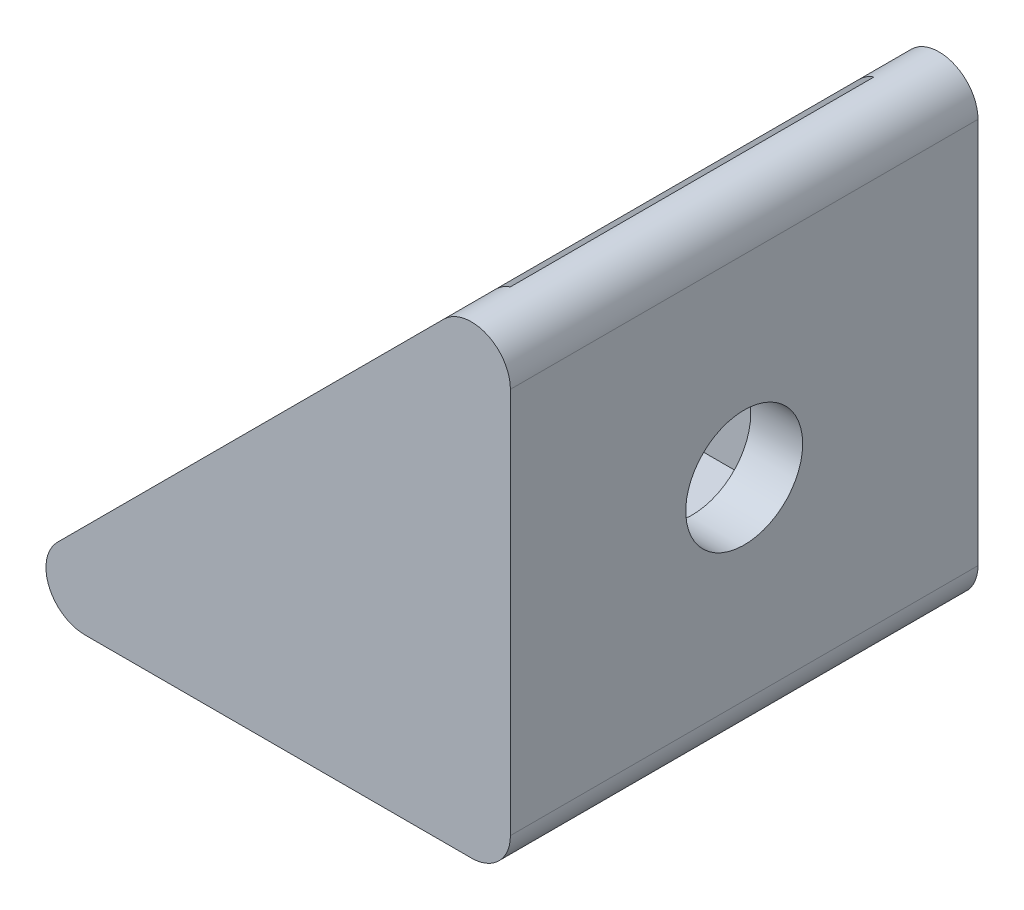
ISO-10303-21;
HEADER;
FILE_DESCRIPTION(('STEP AP214'),'2;1');
FILE_NAME('part.step','',(''),(''),'','','');
FILE_SCHEMA(('AUTOMOTIVE_DESIGN { 1 0 10303 214 1 1 1 1 }'));
ENDSEC;
DATA;
#1=APPLICATION_CONTEXT('core data for automotive mechanical design processes');
#2=APPLICATION_PROTOCOL_DEFINITION('international standard','automotive_design',2000,#1);
#3=PRODUCT_CONTEXT('',#1,'mechanical');
#4=PRODUCT('Part','Part','',(#3));
#5=PRODUCT_RELATED_PRODUCT_CATEGORY('part','',(#4));
#6=PRODUCT_DEFINITION_FORMATION('','',#4);
#7=PRODUCT_DEFINITION_CONTEXT('part definition',#1,'design');
#8=PRODUCT_DEFINITION('design','',#6,#7);
#9=PRODUCT_DEFINITION_SHAPE('','',#8);
#10=(LENGTH_UNIT() NAMED_UNIT(*) SI_UNIT(.MILLI.,.METRE.));
#11=(NAMED_UNIT(*) PLANE_ANGLE_UNIT() SI_UNIT($,.RADIAN.));
#12=(NAMED_UNIT(*) SI_UNIT($,.STERADIAN.) SOLID_ANGLE_UNIT());
#13=UNCERTAINTY_MEASURE_WITH_UNIT(LENGTH_MEASURE(1.E-05),#10,'distance_accuracy_value','');
#14=(GEOMETRIC_REPRESENTATION_CONTEXT(3) GLOBAL_UNCERTAINTY_ASSIGNED_CONTEXT((#13)) GLOBAL_UNIT_ASSIGNED_CONTEXT((#10,
#11,#12)) REPRESENTATION_CONTEXT('',''));
#15=CARTESIAN_POINT('',(0.,0.,0.));
#16=DIRECTION('',(0.,0.,1.));
#17=DIRECTION('',(1.,0.,0.));
#18=AXIS2_PLACEMENT_3D('',#15,#16,#17);
#19=CARTESIAN_POINT('',(-2.56066017177985,17.4393398282202,18.));
#20=DIRECTION('',(0.707106781186547,-0.707106781186547,0.));
#21=DIRECTION('',(0.707106781186548,0.707106781186548,0.));
#22=AXIS2_PLACEMENT_3D('',#19,#20,#21);
#23=PLANE('',#22);
#24=DIRECTION('',(0.,0.,-1.));
#25=VECTOR('',#24,1.);
#26=CARTESIAN_POINT('',(-2.56066017177985,17.4393398282202,18.));
#27=LINE('',#26,#25);
#28=CARTESIAN_POINT('',(-2.56066017177985,17.4393398282202,18.));
#29=VERTEX_POINT('',#28);
#30=CARTESIAN_POINT('',(-2.56066017177985,17.4393398282202,16.));
#31=VERTEX_POINT('',#30);
#32=EDGE_CURVE('E159',#29,#31,#27,.T.);
#33=ORIENTED_EDGE('',*,*,#32,.T.);
#34=DIRECTION('',(-0.707106781186548,-0.707106781186548,0.));
#35=VECTOR('',#34,1.);
#36=CARTESIAN_POINT('',(-2.56066017177985,17.4393398282202,16.));
#37=LINE('',#36,#35);
#38=CARTESIAN_POINT('',(-17.4393398282202,2.56066017177985,16.));
#39=VERTEX_POINT('',#38);
#40=EDGE_CURVE('E183',#31,#39,#37,.T.);
#41=ORIENTED_EDGE('',*,*,#40,.T.);
#42=DIRECTION('',(0.,0.,-1.));
#43=VECTOR('',#42,1.);
#44=CARTESIAN_POINT('',(-17.4393398282202,2.56066017177985,18.));
#45=LINE('',#44,#43);
#46=CARTESIAN_POINT('',(-17.4393398282202,2.56066017177985,18.));
#47=VERTEX_POINT('',#46);
#48=EDGE_CURVE('E155',#47,#39,#45,.T.);
#49=ORIENTED_EDGE('',*,*,#48,.F.);
#50=DIRECTION('',(-0.707106781186547,-0.707106781186547,0.));
#51=VECTOR('',#50,1.);
#52=CARTESIAN_POINT('',(-2.56066017177985,17.4393398282202,18.));
#53=LINE('',#52,#51);
#54=EDGE_CURVE('E100',#29,#47,#53,.T.);
#55=ORIENTED_EDGE('',*,*,#54,.F.);
#56=EDGE_LOOP('',(#33,#41,#49,#55));
#57=FACE_BOUND('',#56,.T.);
#58=ADVANCED_FACE('F39',(#57),#23,.F.);
#59=CARTESIAN_POINT('',(-1.5,16.3786796564404,18.));
#60=DIRECTION('',(0.,0.,-1.));
#61=DIRECTION('',(-1.,0.,0.));
#62=AXIS2_PLACEMENT_3D('',#59,#60,#61);
#63=CYLINDRICAL_SURFACE('',#62,1.5);
#64=DIRECTION('',(0.,0.,-1.));
#65=VECTOR('',#64,1.);
#66=CARTESIAN_POINT('',(-2.,17.7928932188135,18.));
#67=LINE('',#66,#65);
#68=CARTESIAN_POINT('',(-2.,17.7928932188135,2.));
#69=VERTEX_POINT('',#68);
#70=CARTESIAN_POINT('',(-2.,17.7928932188135,16.));
#71=VERTEX_POINT('',#70);
#72=EDGE_CURVE('E11',#69,#71,#67,.F.);
#73=ORIENTED_EDGE('',*,*,#72,.T.);
#74=CARTESIAN_POINT('',(-1.5,16.3786796564404,16.));
#75=DIRECTION('',(0.,0.,1.));
#76=DIRECTION('',(1.,0.,0.));
#77=AXIS2_PLACEMENT_3D('',#74,#75,#76);
#78=CIRCLE('',#77,1.5);
#79=EDGE_CURVE('E141',#71,#31,#78,.T.);
#80=ORIENTED_EDGE('',*,*,#79,.T.);
#81=ORIENTED_EDGE('',*,*,#32,.F.);
#82=CARTESIAN_POINT('',(-1.5,16.3786796564404,18.));
#83=DIRECTION('',(0.,0.,1.));
#84=DIRECTION('',(1.,0.,0.));
#85=AXIS2_PLACEMENT_3D('',#82,#83,#84);
#86=CIRCLE('',#85,1.5);
#87=CARTESIAN_POINT('',(0.,16.3786796564403,18.));
#88=VERTEX_POINT('',#87);
#89=EDGE_CURVE('E150',#88,#29,#86,.T.);
#90=ORIENTED_EDGE('',*,*,#89,.F.);
#91=DIRECTION('',(0.,0.,-1.));
#92=VECTOR('',#91,1.);
#93=CARTESIAN_POINT('',(0.,16.3786796564403,18.));
#94=LINE('',#93,#92);
#95=CARTESIAN_POINT('',(0.,16.3786796564403,0.));
#96=VERTEX_POINT('',#95);
#97=EDGE_CURVE('E133',#88,#96,#94,.T.);
#98=ORIENTED_EDGE('',*,*,#97,.T.);
#99=CARTESIAN_POINT('',(-1.5,16.3786796564404,0.));
#100=DIRECTION('',(0.,0.,1.));
#101=DIRECTION('',(1.,0.,0.));
#102=AXIS2_PLACEMENT_3D('',#99,#100,#101);
#103=CIRCLE('',#102,1.5);
#104=CARTESIAN_POINT('',(-2.56066017177985,17.4393398282202,0.));
#105=VERTEX_POINT('',#104);
#106=EDGE_CURVE('E137',#96,#105,#103,.T.);
#107=ORIENTED_EDGE('',*,*,#106,.T.);
#108=CARTESIAN_POINT('',(-2.56066017177985,17.4393398282202,2.));
#109=VERTEX_POINT('',#108);
#110=EDGE_CURVE('E158',#109,#105,#27,.T.);
#111=ORIENTED_EDGE('',*,*,#110,.F.);
#112=CARTESIAN_POINT('',(-1.5,16.3786796564404,2.));
#113=DIRECTION('',(0.,0.,-1.));
#114=DIRECTION('',(-1.,0.,0.));
#115=AXIS2_PLACEMENT_3D('',#112,#113,#114);
#116=CIRCLE('',#115,1.5);
#117=EDGE_CURVE('E189',#109,#69,#116,.T.);
#118=ORIENTED_EDGE('',*,*,#117,.T.);
#119=EDGE_LOOP('',(#73,#80,#81,#90,#98,#107,#111,#118));
#120=FACE_BOUND('',#119,.T.);
#121=ADVANCED_FACE('F41',(#120),#63,.T.);
#122=CARTESIAN_POINT('',(-17.4393398282202,2.56066017177985,2.));
#123=VERTEX_POINT('',#122);
#124=CARTESIAN_POINT('',(-17.4393398282202,2.56066017177985,0.));
#125=VERTEX_POINT('',#124);
#126=EDGE_CURVE('E154',#123,#125,#45,.T.);
#127=ORIENTED_EDGE('',*,*,#126,.F.);
#128=DIRECTION('',(0.707106781186548,0.707106781186548,0.));
#129=VECTOR('',#128,1.);
#130=CARTESIAN_POINT('',(-2.56066017177985,17.4393398282202,2.));
#131=LINE('',#130,#129);
#132=EDGE_CURVE('E193',#123,#109,#131,.T.);
#133=ORIENTED_EDGE('',*,*,#132,.T.);
#134=ORIENTED_EDGE('',*,*,#110,.T.);
#135=DIRECTION('',(-0.707106781186547,-0.707106781186547,0.));
#136=VECTOR('',#135,1.);
#137=CARTESIAN_POINT('',(-2.56066017177985,17.4393398282202,0.));
#138=LINE('',#137,#136);
#139=EDGE_CURVE('E140',#105,#125,#138,.T.);
#140=ORIENTED_EDGE('',*,*,#139,.T.);
#141=EDGE_LOOP('',(#127,#133,#134,#140));
#142=FACE_BOUND('',#141,.T.);
#143=ADVANCED_FACE('F252',(#142),#23,.F.);
#144=CARTESIAN_POINT('',(-16.3786796564404,1.5,18.));
#145=DIRECTION('',(0.,0.,-1.));
#146=DIRECTION('',(-1.,0.,0.));
#147=AXIS2_PLACEMENT_3D('',#144,#145,#146);
#148=CYLINDRICAL_SURFACE('',#147,1.5);
#149=ORIENTED_EDGE('',*,*,#48,.T.);
#150=CARTESIAN_POINT('',(-16.3786796564404,1.5,16.));
#151=DIRECTION('',(0.,0.,1.));
#152=DIRECTION('',(1.,0.,0.));
#153=AXIS2_PLACEMENT_3D('',#150,#151,#152);
#154=CIRCLE('',#153,1.5);
#155=CARTESIAN_POINT('',(-17.7928932188135,2.,16.));
#156=VERTEX_POINT('',#155);
#157=EDGE_CURVE('E48',#39,#156,#154,.T.);
#158=ORIENTED_EDGE('',*,*,#157,.T.);
#159=DIRECTION('',(0.,0.,-1.));
#160=VECTOR('',#159,1.);
#161=CARTESIAN_POINT('',(-17.7928932188135,2.,18.));
#162=LINE('',#161,#160);
#163=CARTESIAN_POINT('',(-17.7928932188135,2.,2.));
#164=VERTEX_POINT('',#163);
#165=EDGE_CURVE('E161',#164,#156,#162,.F.);
#166=ORIENTED_EDGE('',*,*,#165,.F.);
#167=CARTESIAN_POINT('',(-16.3786796564404,1.5,2.));
#168=DIRECTION('',(0.,0.,-1.));
#169=DIRECTION('',(-1.,0.,0.));
#170=AXIS2_PLACEMENT_3D('',#167,#168,#169);
#171=CIRCLE('',#170,1.5);
#172=EDGE_CURVE('E163',#164,#123,#171,.T.);
#173=ORIENTED_EDGE('',*,*,#172,.T.);
#174=ORIENTED_EDGE('',*,*,#126,.T.);
#175=CARTESIAN_POINT('',(-16.3786796564404,1.5,0.));
#176=DIRECTION('',(0.,0.,1.));
#177=DIRECTION('',(1.,0.,0.));
#178=AXIS2_PLACEMENT_3D('',#175,#176,#177);
#179=CIRCLE('',#178,1.5);
#180=CARTESIAN_POINT('',(-16.3786796564403,0.,0.));
#181=VERTEX_POINT('',#180);
#182=EDGE_CURVE('E144',#125,#181,#179,.T.);
#183=ORIENTED_EDGE('',*,*,#182,.T.);
#184=DIRECTION('',(0.,0.,-1.));
#185=VECTOR('',#184,1.);
#186=CARTESIAN_POINT('',(-16.3786796564403,0.,18.));
#187=LINE('',#186,#185);
#188=CARTESIAN_POINT('',(-16.3786796564403,0.,18.));
#189=VERTEX_POINT('',#188);
#190=EDGE_CURVE('E128',#189,#181,#187,.T.);
#191=ORIENTED_EDGE('',*,*,#190,.F.);
#192=CARTESIAN_POINT('',(-16.3786796564404,1.5,18.));
#193=DIRECTION('',(0.,0.,1.));
#194=DIRECTION('',(1.,0.,0.));
#195=AXIS2_PLACEMENT_3D('',#192,#193,#194);
#196=CIRCLE('',#195,1.5);
#197=EDGE_CURVE('E116',#47,#189,#196,.T.);
#198=ORIENTED_EDGE('',*,*,#197,.F.);
#199=EDGE_LOOP('',(#149,#158,#166,#173,#174,#183,#191,#198));
#200=FACE_BOUND('',#199,.T.);
#201=ADVANCED_FACE('F171',(#200),#148,.T.);
#202=CARTESIAN_POINT('',(-16.3786796564403,0.,18.));
#203=DIRECTION('',(0.,1.,0.));
#204=DIRECTION('',(0.,0.,1.));
#205=AXIS2_PLACEMENT_3D('',#202,#203,#204);
#206=PLANE('',#205);
#207=CARTESIAN_POINT('',(-8.93933982822017,0.,9.));
#208=DIRECTION('',(0.,-1.,0.));
#209=DIRECTION('',(0.,0.,-1.));
#210=AXIS2_PLACEMENT_3D('',#207,#208,#209);
#211=CIRCLE('',#210,2.24999999999999);
#212=CARTESIAN_POINT('',(-8.93933982822017,0.,6.75000000000001));
#213=VERTEX_POINT('',#212);
#214=EDGE_CURVE('E225',#213,#213,#211,.T.);
#215=ORIENTED_EDGE('',*,*,#214,.F.);
#216=EDGE_LOOP('',(#215));
#217=FACE_BOUND('',#216,.T.);
#218=DIRECTION('',(1.,0.,0.));
#219=VECTOR('',#218,1.);
#220=CARTESIAN_POINT('',(-16.3786796564403,0.,0.));
#221=LINE('',#220,#219);
#222=CARTESIAN_POINT('',(-1.50000000000001,0.,0.));
#223=VERTEX_POINT('',#222);
#224=EDGE_CURVE('E125',#181,#223,#221,.T.);
#225=ORIENTED_EDGE('',*,*,#224,.T.);
#226=DIRECTION('',(0.,0.,-1.));
#227=VECTOR('',#226,1.);
#228=CARTESIAN_POINT('',(-1.50000000000001,0.,18.));
#229=LINE('',#228,#227);
#230=CARTESIAN_POINT('',(-1.50000000000001,0.,18.));
#231=VERTEX_POINT('',#230);
#232=EDGE_CURVE('E122',#231,#223,#229,.T.);
#233=ORIENTED_EDGE('',*,*,#232,.F.);
#234=DIRECTION('',(1.,0.,0.));
#235=VECTOR('',#234,1.);
#236=CARTESIAN_POINT('',(-16.3786796564403,0.,18.));
#237=LINE('',#236,#235);
#238=EDGE_CURVE('E109',#189,#231,#237,.T.);
#239=ORIENTED_EDGE('',*,*,#238,.F.);
#240=ORIENTED_EDGE('',*,*,#190,.T.);
#241=EDGE_LOOP('',(#225,#233,#239,#240));
#242=FACE_BOUND('',#241,.T.);
#243=ADVANCED_FACE('F123',(#217,#242),#206,.F.);
#244=CARTESIAN_POINT('',(-1.5,1.5,18.));
#245=DIRECTION('',(0.,0.,-1.));
#246=DIRECTION('',(-1.,0.,0.));
#247=AXIS2_PLACEMENT_3D('',#244,#245,#246);
#248=CYLINDRICAL_SURFACE('',#247,1.5);
#249=CARTESIAN_POINT('',(-1.5,1.5,0.));
#250=DIRECTION('',(0.,0.,1.));
#251=DIRECTION('',(-1.,0.,0.));
#252=AXIS2_PLACEMENT_3D('',#249,#250,#251);
#253=CIRCLE('',#252,1.5);
#254=CARTESIAN_POINT('',(0.,1.50000000000001,0.));
#255=VERTEX_POINT('',#254);
#256=EDGE_CURVE('E147',#223,#255,#253,.T.);
#257=ORIENTED_EDGE('',*,*,#256,.T.);
#258=DIRECTION('',(0.,0.,-1.));
#259=VECTOR('',#258,1.);
#260=CARTESIAN_POINT('',(0.,1.50000000000001,18.));
#261=LINE('',#260,#259);
#262=CARTESIAN_POINT('',(0.,1.50000000000001,18.));
#263=VERTEX_POINT('',#262);
#264=EDGE_CURVE('E129',#263,#255,#261,.T.);
#265=ORIENTED_EDGE('',*,*,#264,.F.);
#266=CARTESIAN_POINT('',(-1.5,1.5,18.));
#267=DIRECTION('',(0.,0.,1.));
#268=DIRECTION('',(-1.,0.,0.));
#269=AXIS2_PLACEMENT_3D('',#266,#267,#268);
#270=CIRCLE('',#269,1.5);
#271=EDGE_CURVE('E113',#231,#263,#270,.T.);
#272=ORIENTED_EDGE('',*,*,#271,.F.);
#273=ORIENTED_EDGE('',*,*,#232,.T.);
#274=EDGE_LOOP('',(#257,#265,#272,#273));
#275=FACE_BOUND('',#274,.T.);
#276=ADVANCED_FACE('F131',(#275),#248,.T.);
#277=CARTESIAN_POINT('',(0.,1.50000000000001,18.));
#278=DIRECTION('',(-1.,0.,0.));
#279=DIRECTION('',(0.,0.,1.));
#280=AXIS2_PLACEMENT_3D('',#277,#278,#279);
#281=PLANE('',#280);
#282=CARTESIAN_POINT('',(0.,8.93933982822016,9.));
#283=DIRECTION('',(1.,0.,0.));
#284=DIRECTION('',(0.,0.,-1.));
#285=AXIS2_PLACEMENT_3D('',#282,#283,#284);
#286=CIRCLE('',#285,2.25);
#287=CARTESIAN_POINT('',(0.,8.93933982822016,6.75));
#288=VERTEX_POINT('',#287);
#289=EDGE_CURVE('E222',#288,#288,#286,.T.);
#290=ORIENTED_EDGE('',*,*,#289,.F.);
#291=EDGE_LOOP('',(#290));
#292=FACE_BOUND('',#291,.T.);
#293=DIRECTION('',(0.,1.,0.));
#294=VECTOR('',#293,1.);
#295=CARTESIAN_POINT('',(0.,1.50000000000001,0.));
#296=LINE('',#295,#294);
#297=EDGE_CURVE('E91',#255,#96,#296,.T.);
#298=ORIENTED_EDGE('',*,*,#297,.T.);
#299=ORIENTED_EDGE('',*,*,#97,.F.);
#300=DIRECTION('',(0.,1.,0.));
#301=VECTOR('',#300,1.);
#302=CARTESIAN_POINT('',(0.,1.50000000000001,18.));
#303=LINE('',#302,#301);
#304=EDGE_CURVE('E64',#263,#88,#303,.T.);
#305=ORIENTED_EDGE('',*,*,#304,.F.);
#306=ORIENTED_EDGE('',*,*,#264,.T.);
#307=EDGE_LOOP('',(#298,#299,#305,#306));
#308=FACE_BOUND('',#307,.T.);
#309=ADVANCED_FACE('F258',(#292,#308),#281,.F.);
#310=CARTESIAN_POINT('',(-1.5,16.3786796564404,18.));
#311=DIRECTION('',(0.,0.,1.));
#312=DIRECTION('',(1.,0.,0.));
#313=AXIS2_PLACEMENT_3D('',#310,#311,#312);
#314=PLANE('',#313);
#315=ORIENTED_EDGE('',*,*,#89,.T.);
#316=ORIENTED_EDGE('',*,*,#54,.T.);
#317=ORIENTED_EDGE('',*,*,#197,.T.);
#318=ORIENTED_EDGE('',*,*,#238,.T.);
#319=ORIENTED_EDGE('',*,*,#271,.T.);
#320=ORIENTED_EDGE('',*,*,#304,.T.);
#321=EDGE_LOOP('',(#315,#316,#317,#318,#319,#320));
#322=FACE_BOUND('',#321,.T.);
#323=ADVANCED_FACE('F111',(#322),#314,.T.);
#324=CARTESIAN_POINT('',(-1.5,16.3786796564404,0.));
#325=DIRECTION('',(0.,0.,1.));
#326=DIRECTION('',(1.,0.,0.));
#327=AXIS2_PLACEMENT_3D('',#324,#325,#326);
#328=PLANE('',#327);
#329=ORIENTED_EDGE('',*,*,#106,.F.);
#330=ORIENTED_EDGE('',*,*,#297,.F.);
#331=ORIENTED_EDGE('',*,*,#256,.F.);
#332=ORIENTED_EDGE('',*,*,#224,.F.);
#333=ORIENTED_EDGE('',*,*,#182,.F.);
#334=ORIENTED_EDGE('',*,*,#139,.F.);
#335=EDGE_LOOP('',(#329,#330,#331,#332,#333,#334));
#336=FACE_BOUND('',#335,.T.);
#337=ADVANCED_FACE('F256',(#336),#328,.F.);
#338=CARTESIAN_POINT('',(-2.,17.8786796564404,2.));
#339=DIRECTION('',(1.,0.,0.));
#340=DIRECTION('',(0.,0.,-1.));
#341=AXIS2_PLACEMENT_3D('',#338,#339,#340);
#342=PLANE('',#341);
#343=CARTESIAN_POINT('',(-2.,8.93933982822016,9.));
#344=DIRECTION('',(1.,0.,0.));
#345=DIRECTION('',(0.,0.,-1.));
#346=AXIS2_PLACEMENT_3D('',#343,#344,#345);
#347=CIRCLE('',#346,2.25);
#348=CARTESIAN_POINT('',(-2.,8.93933982822016,6.75));
#349=VERTEX_POINT('',#348);
#350=EDGE_CURVE('E219',#349,#349,#347,.T.);
#351=ORIENTED_EDGE('',*,*,#350,.T.);
#352=EDGE_LOOP('',(#351));
#353=FACE_BOUND('',#352,.T.);
#354=DIRECTION('',(0.,-1.,0.));
#355=VECTOR('',#354,1.);
#356=CARTESIAN_POINT('',(-2.,17.8786796564404,2.));
#357=LINE('',#356,#355);
#358=CARTESIAN_POINT('',(-2.,2.,2.));
#359=VERTEX_POINT('',#358);
#360=EDGE_CURVE('E211',#69,#359,#357,.T.);
#361=ORIENTED_EDGE('',*,*,#360,.T.);
#362=DIRECTION('',(0.,0.,1.));
#363=VECTOR('',#362,1.);
#364=CARTESIAN_POINT('',(-2.,2.,2.));
#365=LINE('',#364,#363);
#366=CARTESIAN_POINT('',(-2.,2.,16.));
#367=VERTEX_POINT('',#366);
#368=EDGE_CURVE('E210',#359,#367,#365,.T.);
#369=ORIENTED_EDGE('',*,*,#368,.T.);
#370=DIRECTION('',(0.,-1.,0.));
#371=VECTOR('',#370,1.);
#372=CARTESIAN_POINT('',(-2.,17.8786796564404,16.));
#373=LINE('',#372,#371);
#374=EDGE_CURVE('E202',#71,#367,#373,.T.);
#375=ORIENTED_EDGE('',*,*,#374,.F.);
#376=ORIENTED_EDGE('',*,*,#72,.F.);
#377=EDGE_LOOP('',(#361,#369,#375,#376));
#378=FACE_BOUND('',#377,.T.);
#379=ADVANCED_FACE('F208',(#353,#378),#342,.F.);
#380=CARTESIAN_POINT('',(-19.221313325378,17.8786796564404,16.));
#381=DIRECTION('',(0.,0.,1.));
#382=DIRECTION('',(1.,0.,0.));
#383=AXIS2_PLACEMENT_3D('',#380,#381,#382);
#384=PLANE('',#383);
#385=ORIENTED_EDGE('',*,*,#374,.T.);
#386=DIRECTION('',(-1.,0.,0.));
#387=VECTOR('',#386,1.);
#388=CARTESIAN_POINT('',(-19.221313325378,2.,16.));
#389=LINE('',#388,#387);
#390=EDGE_CURVE('E186',#367,#156,#389,.T.);
#391=ORIENTED_EDGE('',*,*,#390,.T.);
#392=ORIENTED_EDGE('',*,*,#157,.F.);
#393=ORIENTED_EDGE('',*,*,#40,.F.);
#394=ORIENTED_EDGE('',*,*,#79,.F.);
#395=EDGE_LOOP('',(#385,#391,#392,#393,#394));
#396=FACE_BOUND('',#395,.T.);
#397=ADVANCED_FACE('F181',(#396),#384,.F.);
#398=CARTESIAN_POINT('',(-19.221313325378,17.8786796564404,2.));
#399=DIRECTION('',(0.,0.,-1.));
#400=DIRECTION('',(-1.,0.,0.));
#401=AXIS2_PLACEMENT_3D('',#398,#399,#400);
#402=PLANE('',#401);
#403=ORIENTED_EDGE('',*,*,#132,.F.);
#404=ORIENTED_EDGE('',*,*,#172,.F.);
#405=DIRECTION('',(1.,0.,0.));
#406=VECTOR('',#405,1.);
#407=CARTESIAN_POINT('',(-19.221313325378,2.,2.));
#408=LINE('',#407,#406);
#409=EDGE_CURVE('E55',#164,#359,#408,.T.);
#410=ORIENTED_EDGE('',*,*,#409,.T.);
#411=ORIENTED_EDGE('',*,*,#360,.F.);
#412=ORIENTED_EDGE('',*,*,#117,.F.);
#413=EDGE_LOOP('',(#403,#404,#410,#411,#412));
#414=FACE_BOUND('',#413,.T.);
#415=ADVANCED_FACE('F237',(#414),#402,.F.);
#416=CARTESIAN_POINT('',(0.,2.,0.));
#417=DIRECTION('',(0.,1.,0.));
#418=DIRECTION('',(0.,0.,1.));
#419=AXIS2_PLACEMENT_3D('',#416,#417,#418);
#420=PLANE('',#419);
#421=CARTESIAN_POINT('',(-8.93933982822017,2.,9.));
#422=DIRECTION('',(0.,1.,0.));
#423=DIRECTION('',(0.,0.,1.));
#424=AXIS2_PLACEMENT_3D('',#421,#422,#423);
#425=CIRCLE('',#424,2.24999999999999);
#426=CARTESIAN_POINT('',(-8.93933982822017,2.,11.25));
#427=VERTEX_POINT('',#426);
#428=EDGE_CURVE('E43',#427,#427,#425,.T.);
#429=ORIENTED_EDGE('',*,*,#428,.F.);
#430=EDGE_LOOP('',(#429));
#431=FACE_BOUND('',#430,.T.);
#432=ORIENTED_EDGE('',*,*,#165,.T.);
#433=ORIENTED_EDGE('',*,*,#390,.F.);
#434=ORIENTED_EDGE('',*,*,#368,.F.);
#435=ORIENTED_EDGE('',*,*,#409,.F.);
#436=EDGE_LOOP('',(#432,#433,#434,#435));
#437=FACE_BOUND('',#436,.T.);
#438=ADVANCED_FACE('F234',(#431,#437),#420,.T.);
#439=CARTESIAN_POINT('',(0.,8.93933982822016,9.));
#440=DIRECTION('',(1.,0.,0.));
#441=DIRECTION('',(0.,0.,-1.));
#442=AXIS2_PLACEMENT_3D('',#439,#440,#441);
#443=CYLINDRICAL_SURFACE('',#442,2.25);
#444=ORIENTED_EDGE('',*,*,#289,.T.);
#445=EDGE_LOOP('',(#444));
#446=FACE_BOUND('',#445,.T.);
#447=ORIENTED_EDGE('',*,*,#350,.F.);
#448=EDGE_LOOP('',(#447));
#449=FACE_BOUND('',#448,.T.);
#450=ADVANCED_FACE('F236',(#446,#449),#443,.F.);
#451=CARTESIAN_POINT('',(-8.93933982822017,0.,9.));
#452=DIRECTION('',(0.,-1.,0.));
#453=DIRECTION('',(0.,0.,-1.));
#454=AXIS2_PLACEMENT_3D('',#451,#452,#453);
#455=CYLINDRICAL_SURFACE('',#454,2.24999999999999);
#456=ORIENTED_EDGE('',*,*,#428,.T.);
#457=EDGE_LOOP('',(#456));
#458=FACE_BOUND('',#457,.T.);
#459=ORIENTED_EDGE('',*,*,#214,.T.);
#460=EDGE_LOOP('',(#459));
#461=FACE_BOUND('',#460,.T.);
#462=ADVANCED_FACE('F232',(#458,#461),#455,.F.);
#463=CLOSED_SHELL('',(#58,#121,#143,#201,#243,#276,#309,#323,#337,#379,#397,#415,#438,#450,#462));
#464=MANIFOLD_SOLID_BREP('B2',#463);
#465=ADVANCED_BREP_SHAPE_REPRESENTATION('',(#18,#464),#14);
#466=SHAPE_DEFINITION_REPRESENTATION(#9,#465);
ENDSEC;
END-ISO-10303-21;
